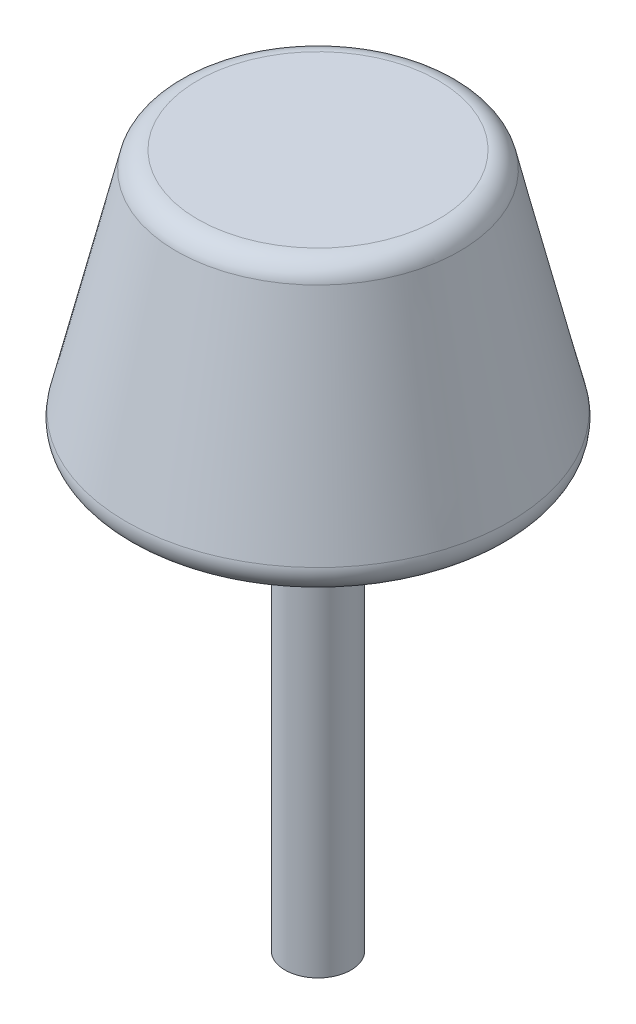
ISO-10303-21;
HEADER;
FILE_DESCRIPTION(('STEP AP214'),'2;1');
FILE_NAME('part.step','',(''),(''),'','','');
FILE_SCHEMA(('AUTOMOTIVE_DESIGN { 1 0 10303 214 1 1 1 1 }'));
ENDSEC;
DATA;
#1=APPLICATION_CONTEXT('core data for automotive mechanical design processes');
#2=APPLICATION_PROTOCOL_DEFINITION('international standard','automotive_design',2000,#1);
#3=PRODUCT_CONTEXT('',#1,'mechanical');
#4=PRODUCT('Part','Part','',(#3));
#5=PRODUCT_RELATED_PRODUCT_CATEGORY('part','',(#4));
#6=PRODUCT_DEFINITION_FORMATION('','',#4);
#7=PRODUCT_DEFINITION_CONTEXT('part definition',#1,'design');
#8=PRODUCT_DEFINITION('design','',#6,#7);
#9=PRODUCT_DEFINITION_SHAPE('','',#8);
#10=(LENGTH_UNIT() NAMED_UNIT(*) SI_UNIT(.MILLI.,.METRE.));
#11=(NAMED_UNIT(*) PLANE_ANGLE_UNIT() SI_UNIT($,.RADIAN.));
#12=(NAMED_UNIT(*) SI_UNIT($,.STERADIAN.) SOLID_ANGLE_UNIT());
#13=UNCERTAINTY_MEASURE_WITH_UNIT(LENGTH_MEASURE(1.E-05),#10,'distance_accuracy_value','');
#14=(GEOMETRIC_REPRESENTATION_CONTEXT(3) GLOBAL_UNCERTAINTY_ASSIGNED_CONTEXT((#13)) GLOBAL_UNIT_ASSIGNED_CONTEXT((#10,
#11,#12)) REPRESENTATION_CONTEXT('',''));
#15=CARTESIAN_POINT('',(0.,0.,0.));
#16=DIRECTION('',(0.,0.,1.));
#17=DIRECTION('',(1.,0.,0.));
#18=AXIS2_PLACEMENT_3D('',#15,#16,#17);
#19=CARTESIAN_POINT('',(3.,-40.,0.));
#20=DIRECTION('',(0.,-1.,0.));
#21=DIRECTION('',(0.,0.,-1.));
#22=AXIS2_PLACEMENT_3D('',#19,#20,#21);
#23=PLANE('',#22);
#24=CARTESIAN_POINT('',(0.,-40.,0.));
#25=DIRECTION('',(0.,-1.,0.));
#26=DIRECTION('',(0.,0.,-1.));
#27=AXIS2_PLACEMENT_3D('',#24,#25,#26);
#28=CIRCLE('',#27,3.);
#29=CARTESIAN_POINT('',(0.,-40.,-3.));
#30=VERTEX_POINT('',#29);
#31=EDGE_CURVE('E60',#30,#30,#28,.T.);
#32=ORIENTED_EDGE('',*,*,#31,.T.);
#33=EDGE_LOOP('',(#32));
#34=FACE_BOUND('',#33,.T.);
#35=ADVANCED_FACE('F37',(#34),#23,.T.);
#36=CARTESIAN_POINT('',(0.,23.,0.));
#37=DIRECTION('',(0.,1.,0.));
#38=DIRECTION('',(0.,0.,1.));
#39=AXIS2_PLACEMENT_3D('',#36,#37,#38);
#40=PLANE('',#39);
#41=CARTESIAN_POINT('',(0.,23.,0.));
#42=DIRECTION('',(0.,1.,0.));
#43=DIRECTION('',(0.,0.,1.));
#44=AXIS2_PLACEMENT_3D('',#41,#42,#43);
#45=CIRCLE('',#44,10.9218724190634);
#46=CARTESIAN_POINT('',(0.,23.,10.9218724190634));
#47=VERTEX_POINT('',#46);
#48=EDGE_CURVE('E10',#47,#47,#45,.T.);
#49=ORIENTED_EDGE('',*,*,#48,.T.);
#50=EDGE_LOOP('',(#49));
#51=FACE_BOUND('',#50,.T.);
#52=ADVANCED_FACE('F80',(#51),#40,.T.);
#53=CARTESIAN_POINT('',(0.,0.,0.));
#54=DIRECTION('',(0.,-1.,0.));
#55=DIRECTION('',(0.,0.,-1.));
#56=AXIS2_PLACEMENT_3D('',#53,#54,#55);
#57=CONICAL_SURFACE('',#56,18.,0.234722612485197);
#58=CARTESIAN_POINT('',(0.,2.46514642644341,0.));
#59=DIRECTION('',(0.,1.,0.));
#60=DIRECTION('',(0.,0.,1.));
#61=AXIS2_PLACEMENT_3D('',#58,#59,#60);
#62=CIRCLE('',#61,17.4105084632418);
#63=CARTESIAN_POINT('',(0.,2.46514642644341,17.4105084632418));
#64=VERTEX_POINT('',#63);
#65=EDGE_CURVE('E44',#64,#64,#62,.T.);
#66=ORIENTED_EDGE('',*,*,#65,.T.);
#67=EDGE_LOOP('',(#66));
#68=FACE_BOUND('',#67,.T.);
#69=CARTESIAN_POINT('',(0.,21.4651464264434,0.));
#70=DIRECTION('',(0.,1.,0.));
#71=DIRECTION('',(0.,0.,1.));
#72=AXIS2_PLACEMENT_3D('',#69,#70,#71);
#73=CIRCLE('',#72,12.8670302023722);
#74=CARTESIAN_POINT('',(0.,21.4651464264434,12.8670302023722));
#75=VERTEX_POINT('',#74);
#76=EDGE_CURVE('E48',#75,#75,#73,.F.);
#77=ORIENTED_EDGE('',*,*,#76,.T.);
#78=EDGE_LOOP('',(#77));
#79=FACE_BOUND('',#78,.T.);
#80=ADVANCED_FACE('F76',(#68,#79),#57,.T.);
#81=CARTESIAN_POINT('',(3.,0.,0.));
#82=DIRECTION('',(0.,-1.,0.));
#83=DIRECTION('',(0.,0.,-1.));
#84=AXIS2_PLACEMENT_3D('',#81,#82,#83);
#85=PLANE('',#84);
#86=CARTESIAN_POINT('',(0.,0.,0.));
#87=DIRECTION('',(0.,-1.,0.));
#88=DIRECTION('',(0.,0.,-1.));
#89=AXIS2_PLACEMENT_3D('',#86,#87,#88);
#90=CIRCLE('',#89,15.465350679933);
#91=CARTESIAN_POINT('',(0.,0.,-15.465350679933));
#92=VERTEX_POINT('',#91);
#93=EDGE_CURVE('E52',#92,#92,#90,.T.);
#94=ORIENTED_EDGE('',*,*,#93,.T.);
#95=EDGE_LOOP('',(#94));
#96=FACE_BOUND('',#95,.T.);
#97=CARTESIAN_POINT('',(0.,0.,0.));
#98=DIRECTION('',(0.,-1.,0.));
#99=DIRECTION('',(0.,0.,-1.));
#100=AXIS2_PLACEMENT_3D('',#97,#98,#99);
#101=CIRCLE('',#100,3.);
#102=CARTESIAN_POINT('',(0.,0.,-3.));
#103=VERTEX_POINT('',#102);
#104=EDGE_CURVE('E57',#103,#103,#101,.T.);
#105=ORIENTED_EDGE('',*,*,#104,.F.);
#106=EDGE_LOOP('',(#105));
#107=FACE_BOUND('',#106,.T.);
#108=ADVANCED_FACE('F68',(#96,#107),#85,.T.);
#109=CARTESIAN_POINT('',(0.,0.,0.));
#110=DIRECTION('',(0.,-1.,0.));
#111=DIRECTION('',(0.,0.,-1.));
#112=AXIS2_PLACEMENT_3D('',#109,#110,#111);
#113=CYLINDRICAL_SURFACE('',#112,3.);
#114=ORIENTED_EDGE('',*,*,#104,.T.);
#115=EDGE_LOOP('',(#114));
#116=FACE_BOUND('',#115,.T.);
#117=ORIENTED_EDGE('',*,*,#31,.F.);
#118=EDGE_LOOP('',(#117));
#119=FACE_BOUND('',#118,.T.);
#120=ADVANCED_FACE('F65',(#116,#119),#113,.T.);
#121=CARTESIAN_POINT('',(0.,2.,0.));
#122=DIRECTION('',(0.,-1.,0.));
#123=DIRECTION('',(0.,0.,-1.));
#124=AXIS2_PLACEMENT_3D('',#121,#122,#123);
#125=TOROIDAL_SURFACE('',#124,15.465350679933,2.);
#126=ORIENTED_EDGE('',*,*,#65,.F.);
#127=EDGE_LOOP('',(#126));
#128=FACE_BOUND('',#127,.T.);
#129=ORIENTED_EDGE('',*,*,#93,.F.);
#130=EDGE_LOOP('',(#129));
#131=FACE_BOUND('',#130,.T.);
#132=ADVANCED_FACE('F67',(#128,#131),#125,.T.);
#133=CARTESIAN_POINT('',(0.,21.,0.));
#134=DIRECTION('',(0.,1.,0.));
#135=DIRECTION('',(0.,0.,1.));
#136=AXIS2_PLACEMENT_3D('',#133,#134,#135);
#137=TOROIDAL_SURFACE('',#136,10.9218724190634,2.);
#138=ORIENTED_EDGE('',*,*,#48,.F.);
#139=EDGE_LOOP('',(#138));
#140=FACE_BOUND('',#139,.T.);
#141=ORIENTED_EDGE('',*,*,#76,.F.);
#142=EDGE_LOOP('',(#141));
#143=FACE_BOUND('',#142,.T.);
#144=ADVANCED_FACE('F39',(#140,#143),#137,.T.);
#145=CLOSED_SHELL('',(#35,#52,#80,#108,#120,#132,#144));
#146=MANIFOLD_SOLID_BREP('B2',#145);
#147=ADVANCED_BREP_SHAPE_REPRESENTATION('',(#18,#146),#14);
#148=SHAPE_DEFINITION_REPRESENTATION(#9,#147);
ENDSEC;
END-ISO-10303-21;
